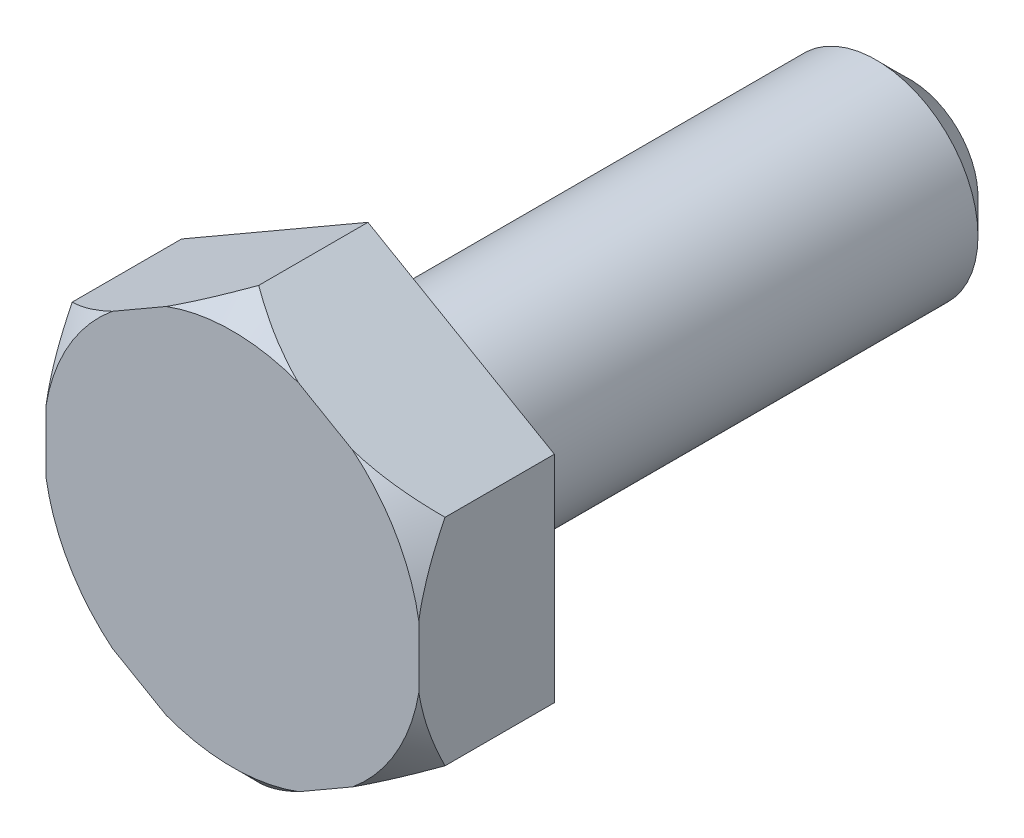
ISO-10303-21;
HEADER;
FILE_DESCRIPTION(('STEP AP214'),'2;1');
FILE_NAME('part.step','',(''),(''),'','','');
FILE_SCHEMA(('AUTOMOTIVE_DESIGN { 1 0 10303 214 1 1 1 1 }'));
ENDSEC;
DATA;
#1=APPLICATION_CONTEXT('core data for automotive mechanical design processes');
#2=APPLICATION_PROTOCOL_DEFINITION('international standard','automotive_design',2000,#1);
#3=PRODUCT_CONTEXT('',#1,'mechanical');
#4=PRODUCT('Part','Part','',(#3));
#5=PRODUCT_RELATED_PRODUCT_CATEGORY('part','',(#4));
#6=PRODUCT_DEFINITION_FORMATION('','',#4);
#7=PRODUCT_DEFINITION_CONTEXT('part definition',#1,'design');
#8=PRODUCT_DEFINITION('design','',#6,#7);
#9=PRODUCT_DEFINITION_SHAPE('','',#8);
#10=(LENGTH_UNIT() NAMED_UNIT(*) SI_UNIT(.MILLI.,.METRE.));
#11=(NAMED_UNIT(*) PLANE_ANGLE_UNIT() SI_UNIT($,.RADIAN.));
#12=(NAMED_UNIT(*) SI_UNIT($,.STERADIAN.) SOLID_ANGLE_UNIT());
#13=UNCERTAINTY_MEASURE_WITH_UNIT(LENGTH_MEASURE(1.E-05),#10,'distance_accuracy_value','');
#14=(GEOMETRIC_REPRESENTATION_CONTEXT(3) GLOBAL_UNCERTAINTY_ASSIGNED_CONTEXT((#13)) GLOBAL_UNIT_ASSIGNED_CONTEXT((#10,
#11,#12)) REPRESENTATION_CONTEXT('',''));
#15=CARTESIAN_POINT('',(0.,0.,0.));
#16=DIRECTION('',(0.,0.,1.));
#17=DIRECTION('',(1.,0.,0.));
#18=AXIS2_PLACEMENT_3D('',#15,#16,#17);
#19=CARTESIAN_POINT('',(2.75,1.58771324027147,2.));
#20=DIRECTION('',(-0.5,-0.866025403784439,0.));
#21=DIRECTION('',(0.866025403784439,-0.5,0.));
#22=AXIS2_PLACEMENT_3D('',#19,#20,#21);
#23=PLANE('',#22);
#24=CARTESIAN_POINT('',(4.66958955139388,0.479437696040624,0.093788957752243));
#25=CARTESIAN_POINT('',(4.60441484032006,0.517066333023451,0.154774737741755));
#26=CARTESIAN_POINT('',(4.53898089465047,0.554844639169929,0.215392406104886));
#27=CARTESIAN_POINT('',(4.40750606838666,0.630751665504996,0.335757370131462));
#28=CARTESIAN_POINT('',(4.34146513347783,0.668880417052145,0.395504586643845));
#29=CARTESIAN_POINT('',(4.1420076299657,0.78403726039676,0.573498791017025));
#30=CARTESIAN_POINT('',(4.00755920868051,0.861661092617886,0.690212913346168));
#31=CARTESIAN_POINT('',(3.73126732462415,1.02117828625273,0.921061723123524));
#32=CARTESIAN_POINT('',(3.58932217595587,1.10313035604653,1.03503637408588));
#33=CARTESIAN_POINT('',(3.3726061216146,1.22825142835817,1.19917277096917));
#34=CARTESIAN_POINT('',(3.29976455167439,1.27030652837135,1.25272706335612));
#35=CARTESIAN_POINT('',(3.15259148483079,1.35527693813097,1.357023187916));
#36=CARTESIAN_POINT('',(3.07826017850231,1.39819213784893,1.40776537674035));
#37=CARTESIAN_POINT('',(2.92603549038609,1.48607910251013,1.50696275400355));
#38=CARTESIAN_POINT('',(2.84809945877353,1.53107549134122,1.55533124355562));
#39=CARTESIAN_POINT('',(2.69017668777735,1.62225224568703,1.64745507024101));
#40=CARTESIAN_POINT('',(2.61018965810214,1.66843277880169,1.69120974982009));
#41=CARTESIAN_POINT('',(2.44842869871677,1.76182551224721,1.77266387572655));
#42=CARTESIAN_POINT('',(2.36666679801926,1.80903076762437,1.81039484404114));
#43=CARTESIAN_POINT('',(2.20089991474521,1.90473632230537,1.87863115630092));
#44=CARTESIAN_POINT('',(2.11689561718412,1.95323622611535,1.90913867940756));
#45=CARTESIAN_POINT('',(1.96344796652334,2.04182926853087,1.95624934937513));
#46=CARTESIAN_POINT('',(1.89436394685422,2.08171494588354,1.97440428968936));
#47=CARTESIAN_POINT('',(1.75514782791657,2.16209140962772,2.00423252626804));
#48=CARTESIAN_POINT('',(1.68501588246467,2.20258210721317,2.01590676436966));
#49=CARTESIAN_POINT('',(1.54425450935462,2.28385072386976,2.03217388051576));
#50=CARTESIAN_POINT('',(1.47362617375373,2.32462801244135,2.03677917847732));
#51=CARTESIAN_POINT('',(1.3322931707472,2.40622665977255,2.0386947686257));
#52=CARTESIAN_POINT('',(1.26158850253329,2.44704801899881,2.03600498279361));
#53=CARTESIAN_POINT('',(1.12085109137616,2.52830280121543,2.02349645099222));
#54=CARTESIAN_POINT('',(1.0508170596106,2.56873696830771,2.01369673011655));
#55=CARTESIAN_POINT('',(0.911678683235909,2.64906854736225,1.98749176240281));
#56=CARTESIAN_POINT('',(0.842574563268565,2.6889658296275,1.97108494805404));
#57=CARTESIAN_POINT('',(0.705423434323579,2.76815007084355,1.93234245836785));
#58=CARTESIAN_POINT('',(0.637380145036866,2.80743488222978,1.90998943632815));
#59=CARTESIAN_POINT('',(0.502722664151644,2.88517941506726,1.86020318748511));
#60=CARTESIAN_POINT('',(0.436108404884452,2.92363917558704,1.83277020182783));
#61=CARTESIAN_POINT('',(0.280797222208242,3.01330812871331,1.76306052867668));
#62=CARTESIAN_POINT('',(0.192709389397134,3.06416566269914,1.71898144548281));
#63=CARTESIAN_POINT('',(0.0190240142354092,3.16444296080306,1.62466513161923));
#64=CARTESIAN_POINT('',(-0.0665721787200468,3.2138619458475,1.57442463816634));
#65=CARTESIAN_POINT('',(-0.235694614989529,3.31150482995369,1.46906452792055));
#66=CARTESIAN_POINT('',(-0.319216183468037,3.3597260299979,1.41393498180409));
#67=CARTESIAN_POINT('',(-0.484296668894426,3.45503529269678,1.29994998261181));
#68=CARTESIAN_POINT('',(-0.5658559283834,3.50212355311764,1.24109518642519));
#69=CARTESIAN_POINT('',(-0.72768872041682,3.59555775916185,1.12016577951028));
#70=CARTESIAN_POINT('',(-0.807954624092135,3.64189930025554,1.05807761783114));
#71=CARTESIAN_POINT('',(-0.967073214839702,3.73376646145672,0.931526648468574));
#72=CARTESIAN_POINT('',(-1.04592578337278,3.77929201312558,0.867063642974939));
#73=CARTESIAN_POINT('',(-1.28052409052519,3.91473740891146,0.67097235512431));
#74=CARTESIAN_POINT('',(-1.4344906124915,4.0036300218149,0.536504118011291));
#75=CARTESIAN_POINT('',(-1.64275524246288,4.12387166199155,0.349080544323272));
#76=CARTESIAN_POINT('',(-1.69855409741102,4.15608714591634,0.298311225114301));
#77=CARTESIAN_POINT('',(-1.80949235141935,4.22013737673147,0.196378418456148));
#78=CARTESIAN_POINT('',(-1.86463354967088,4.25197316238543,0.145217542902118));
#79=CARTESIAN_POINT('',(-1.91958955139388,4.28370202477379,0.0937889577522435));
#80=B_SPLINE_CURVE_WITH_KNOTS('',3,(#24,#25,#26,#27,#28,#29,#30,#31,#32,#33,#34,#35,#36,#37,#38,
#39,#40,#41,#42,#43,#44,#45,#46,#47,#48,#49,#50,#51,#52,#53,#54,#55,#56,#57,#58,#59,#60,#61,#62,
#63,#64,#65,#66,#67,#68,#69,#70,#71,#72,#73,#74,#75,#76,#77,#78,#79),.UNSPECIFIED.,.F.,.F.,(4,2,
2,2,2,2,2,2,2,2,2,2,2,2,2,2,2,2,2,2,2,2,2,2,2,2,2,4),(0.,0.290595858345574,0.581217977981452,
1.16381598655404,1.76248956268558,2.06158497069685,2.36064235803204,2.66703976306786,
2.97348077661449,3.27826153997064,3.58295023989828,3.82815016223384,4.07331444045406,
4.31804747729323,4.56278313149482,4.80686631468259,5.0510074399324,5.29586875398521,
5.54071844744164,5.87300523717871,6.20546875586519,6.53862366394367,6.87171998818303,
7.20634671156636,7.54100137064173,8.20956289811674,8.45565152417676,8.70068842299397),.UNSPECIFIED.);
#81=CARTESIAN_POINT('',(2.75,1.58771324027147,1.6125));
#82=VERTEX_POINT('',#81);
#83=CARTESIAN_POINT('',(1.7718948798919,2.15242249466163,2.));
#84=VERTEX_POINT('',#83);
#85=EDGE_CURVE('E120',#82,#84,#80,.T.);
#86=ORIENTED_EDGE('',*,*,#85,.F.);
#87=DIRECTION('',(0.,0.,-1.));
#88=VECTOR('',#87,1.);
#89=CARTESIAN_POINT('',(2.75,1.58771324027147,2.));
#90=LINE('',#89,#88);
#91=CARTESIAN_POINT('',(2.75,1.58771324027147,0.));
#92=VERTEX_POINT('',#91);
#93=EDGE_CURVE('E131',#82,#92,#90,.T.);
#94=ORIENTED_EDGE('',*,*,#93,.T.);
#95=DIRECTION('',(-0.866025403784439,0.5,0.));
#96=VECTOR('',#95,1.);
#97=CARTESIAN_POINT('',(2.75,1.58771324027147,0.));
#98=LINE('',#97,#96);
#99=CARTESIAN_POINT('',(0.,3.17542648054294,0.));
#100=VERTEX_POINT('',#99);
#101=EDGE_CURVE('E210',#92,#100,#98,.T.);
#102=ORIENTED_EDGE('',*,*,#101,.T.);
#103=DIRECTION('',(0.,0.,-1.));
#104=VECTOR('',#103,1.);
#105=CARTESIAN_POINT('',(0.,3.17542648054294,2.));
#106=LINE('',#105,#104);
#107=CARTESIAN_POINT('',(0.,3.17542648054294,1.6125));
#108=VERTEX_POINT('',#107);
#109=EDGE_CURVE('E156',#108,#100,#106,.T.);
#110=ORIENTED_EDGE('',*,*,#109,.F.);
#111=CARTESIAN_POINT('',(0.978105120108094,2.61071722615278,2.));
#112=VERTEX_POINT('',#111);
#113=EDGE_CURVE('E137',#112,#108,#80,.T.);
#114=ORIENTED_EDGE('',*,*,#113,.F.);
#115=DIRECTION('',(-0.866025403784439,0.5,0.));
#116=VECTOR('',#115,1.);
#117=CARTESIAN_POINT('',(2.75,1.58771324027147,2.));
#118=LINE('',#117,#116);
#119=EDGE_CURVE('E135',#84,#112,#118,.T.);
#120=ORIENTED_EDGE('',*,*,#119,.F.);
#121=EDGE_LOOP('',(#86,#94,#102,#110,#114,#120));
#122=FACE_BOUND('',#121,.T.);
#123=ADVANCED_FACE('F29',(#122),#23,.F.);
#124=CARTESIAN_POINT('',(0.,3.17542648054294,2.));
#125=DIRECTION('',(0.5,-0.866025403784439,0.));
#126=DIRECTION('',(0.866025403784439,0.5,0.));
#127=AXIS2_PLACEMENT_3D('',#124,#125,#126);
#128=PLANE('',#127);
#129=CARTESIAN_POINT('',(1.91958955139388,4.28370202477379,0.0937889577522418));
#130=CARTESIAN_POINT('',(1.85441484032006,4.24607338779096,0.154774737741754));
#131=CARTESIAN_POINT('',(1.78898089465047,4.20829508164449,0.215392406104885));
#132=CARTESIAN_POINT('',(1.65750606838666,4.13238805530942,0.335757370131461));
#133=CARTESIAN_POINT('',(1.59146513347783,4.09425930376227,0.395504586643845));
#134=CARTESIAN_POINT('',(1.3920076299657,3.97910246041765,0.573498791017025));
#135=CARTESIAN_POINT('',(1.25755920868051,3.90147862819653,0.690212913346168));
#136=CARTESIAN_POINT('',(0.981267324624152,3.74196143456168,0.921061723123524));
#137=CARTESIAN_POINT('',(0.839322175955873,3.66000936476789,1.03503637408588));
#138=CARTESIAN_POINT('',(0.622606121614599,3.53488829245624,1.19917277096917));
#139=CARTESIAN_POINT('',(0.549764551674393,3.49283319244307,1.25272706335612));
#140=CARTESIAN_POINT('',(0.402591484830788,3.40786278268345,1.357023187916));
#141=CARTESIAN_POINT('',(0.328260178502314,3.36494758296549,1.40776537674035));
#142=CARTESIAN_POINT('',(0.176035490386096,3.27706061830428,1.50696275400355));
#143=CARTESIAN_POINT('',(0.0980994587735362,3.2320642294732,1.55533124355562));
#144=CARTESIAN_POINT('',(-0.059823312222643,3.14088747512738,1.64745507024101));
#145=CARTESIAN_POINT('',(-0.139810341897853,3.09470694201272,1.69120974982009));
#146=CARTESIAN_POINT('',(-0.301571301283232,3.0013142085672,1.77266387572655));
#147=CARTESIAN_POINT('',(-0.383333201980741,2.95410895319004,1.81039484404114));
#148=CARTESIAN_POINT('',(-0.549100085254788,2.85840339850904,1.87863115630092));
#149=CARTESIAN_POINT('',(-0.633104382815874,2.80990349469906,1.90913867940756));
#150=CARTESIAN_POINT('',(-0.786552033476664,2.72131045228354,1.95624934937513));
#151=CARTESIAN_POINT('',(-0.855636053145779,2.68142477493088,1.97440428968936));
#152=CARTESIAN_POINT('',(-0.994852172083431,2.60104831118669,2.00423252626804));
#153=CARTESIAN_POINT('',(-1.06498411753532,2.56055761360125,2.01590676436966));
#154=CARTESIAN_POINT('',(-1.20574549064538,2.47928899694465,2.03217388051576));
#155=CARTESIAN_POINT('',(-1.27637382624627,2.43851170837306,2.03677917847732));
#156=CARTESIAN_POINT('',(-1.4177068292528,2.35691306104187,2.0386947686257));
#157=CARTESIAN_POINT('',(-1.48841149746671,2.3160917018156,2.03600498279361));
#158=CARTESIAN_POINT('',(-1.62914890862384,2.23483691959898,2.02349645099222));
#159=CARTESIAN_POINT('',(-1.69918294038939,2.1944027525067,2.01369673011655));
#160=CARTESIAN_POINT('',(-1.83832131676409,2.11407117345217,1.98749176240281));
#161=CARTESIAN_POINT('',(-1.90742543673143,2.07417389118691,1.97108494805404));
#162=CARTESIAN_POINT('',(-2.04457656567642,1.99498964997086,1.93234245836785));
#163=CARTESIAN_POINT('',(-2.11261985496313,1.95570483858463,1.90998943632815));
#164=CARTESIAN_POINT('',(-2.24727733584835,1.87796030574715,1.86020318748511));
#165=CARTESIAN_POINT('',(-2.31389159511555,1.83950054522737,1.83277020182782));
#166=CARTESIAN_POINT('',(-2.46920277779176,1.7498315921011,1.76306052867668));
#167=CARTESIAN_POINT('',(-2.55729061060286,1.69897405811527,1.71898144548281));
#168=CARTESIAN_POINT('',(-2.73097598576459,1.59869676001135,1.62466513161923));
#169=CARTESIAN_POINT('',(-2.81657217872005,1.54927777496691,1.57442463816634));
#170=CARTESIAN_POINT('',(-2.98569461498953,1.45163489086072,1.46906452792055));
#171=CARTESIAN_POINT('',(-3.06921618346804,1.40341369081652,1.41393498180409));
#172=CARTESIAN_POINT('',(-3.23429666889443,1.30810442811764,1.29994998261181));
#173=CARTESIAN_POINT('',(-3.3158559283834,1.26101616769677,1.24109518642519));
#174=CARTESIAN_POINT('',(-3.47768872041682,1.16758196165257,1.12016577951028));
#175=CARTESIAN_POINT('',(-3.55795462409213,1.12124042055887,1.05807761783114));
#176=CARTESIAN_POINT('',(-3.7170732148397,1.02937325935769,0.931526648468572));
#177=CARTESIAN_POINT('',(-3.79592578337278,0.983847707688829,0.867063642974937));
#178=CARTESIAN_POINT('',(-4.03052409052519,0.848402311902952,0.670972355124308));
#179=CARTESIAN_POINT('',(-4.1844906124915,0.759509698999514,0.536504118011289));
#180=CARTESIAN_POINT('',(-4.39275524246288,0.639268058822856,0.34908054432327));
#181=CARTESIAN_POINT('',(-4.44855409741102,0.607052574898074,0.298311225114299));
#182=CARTESIAN_POINT('',(-4.55949235141935,0.543002344082941,0.196378418456146));
#183=CARTESIAN_POINT('',(-4.61463354967088,0.51116655842898,0.145217542902116));
#184=CARTESIAN_POINT('',(-4.66958955139388,0.479437696040621,0.0937889577522409));
#185=B_SPLINE_CURVE_WITH_KNOTS('',3,(#129,#130,#131,#132,#133,#134,#135,#136,#137,#138,#139,
#140,#141,#142,#143,#144,#145,#146,#147,#148,#149,#150,#151,#152,#153,#154,#155,#156,#157,#158,
#159,#160,#161,#162,#163,#164,#165,#166,#167,#168,#169,#170,#171,#172,#173,#174,#175,#176,#177,
#178,#179,#180,#181,#182,#183,#184),.UNSPECIFIED.,.F.,.F.,(4,2,2,2,2,2,2,2,2,2,2,2,2,2,2,2,2,2,
2,2,2,2,2,2,2,2,2,4),(0.,0.290595858345574,0.581217977981453,1.16381598655404,1.76248956268558,
2.06158497069685,2.36064235803204,2.66703976306787,2.97348077661449,3.27826153997064,
3.58295023989828,3.82815016223384,4.07331444045406,4.31804747729324,4.56278313149482,
4.8068663146826,5.0510074399324,5.29586875398522,5.54071844744165,5.87300523717871,
6.2054687558652,6.53862366394368,6.87171998818303,7.20634671156637,7.54100137064173,
8.20956289811675,8.45565152417677,8.70068842299398),.UNSPECIFIED.);
#186=CARTESIAN_POINT('',(-0.978105120108092,2.61071722615278,2.));
#187=VERTEX_POINT('',#186);
#188=EDGE_CURVE('E218',#108,#187,#185,.T.);
#189=ORIENTED_EDGE('',*,*,#188,.F.);
#190=ORIENTED_EDGE('',*,*,#109,.T.);
#191=DIRECTION('',(-0.866025403784439,-0.5,0.));
#192=VECTOR('',#191,1.);
#193=CARTESIAN_POINT('',(0.,3.17542648054294,0.));
#194=LINE('',#193,#192);
#195=CARTESIAN_POINT('',(-2.75,1.58771324027147,0.));
#196=VERTEX_POINT('',#195);
#197=EDGE_CURVE('E207',#100,#196,#194,.T.);
#198=ORIENTED_EDGE('',*,*,#197,.T.);
#199=DIRECTION('',(0.,0.,-1.));
#200=VECTOR('',#199,1.);
#201=CARTESIAN_POINT('',(-2.75,1.58771324027147,2.));
#202=LINE('',#201,#200);
#203=CARTESIAN_POINT('',(-2.75,1.58771324027147,1.6125));
#204=VERTEX_POINT('',#203);
#205=EDGE_CURVE('E154',#204,#196,#202,.T.);
#206=ORIENTED_EDGE('',*,*,#205,.F.);
#207=CARTESIAN_POINT('',(-1.77189487989191,2.15242249466163,2.));
#208=VERTEX_POINT('',#207);
#209=EDGE_CURVE('E212',#208,#204,#185,.T.);
#210=ORIENTED_EDGE('',*,*,#209,.F.);
#211=DIRECTION('',(-0.866025403784439,-0.5,0.));
#212=VECTOR('',#211,1.);
#213=CARTESIAN_POINT('',(0.,3.17542648054294,2.));
#214=LINE('',#213,#212);
#215=EDGE_CURVE('E194',#187,#208,#214,.T.);
#216=ORIENTED_EDGE('',*,*,#215,.F.);
#217=EDGE_LOOP('',(#189,#190,#198,#206,#210,#216));
#218=FACE_BOUND('',#217,.T.);
#219=ADVANCED_FACE('F226',(#218),#128,.F.);
#220=CARTESIAN_POINT('',(-2.75,1.58771324027147,2.));
#221=DIRECTION('',(1.,0.,0.));
#222=DIRECTION('',(0.,1.,0.));
#223=AXIS2_PLACEMENT_3D('',#220,#221,#222);
#224=PLANE('',#223);
#225=CARTESIAN_POINT('',(-2.75,3.50730279166535,0.33105842411323));
#226=CARTESIAN_POINT('',(-2.75,3.42870317339037,0.392900907457568));
#227=CARTESIAN_POINT('',(-2.75,3.34972620804174,0.454269938288023));
#228=CARTESIAN_POINT('',(-2.75,3.19087184058861,0.575857610553295));
#229=CARTESIAN_POINT('',(-2.75,3.11099429268869,0.636076061341786));
#230=CARTESIAN_POINT('',(-2.75,2.94981264678402,0.755439373877893));
#231=CARTESIAN_POINT('',(-2.75,2.86850338061817,0.814577275130536));
#232=CARTESIAN_POINT('',(-2.75,2.70469217770677,0.931172957965213));
#233=CARTESIAN_POINT('',(-2.75,2.62219029821338,0.988630819800968));
#234=CARTESIAN_POINT('',(-2.75,2.45167557605139,1.10430121860068));
#235=CARTESIAN_POINT('',(-2.75,2.3635921845117,1.1624101522015));
#236=CARTESIAN_POINT('',(-2.75,2.1856429567431,1.27582833555173));
#237=CARTESIAN_POINT('',(-2.75,2.09577726966914,1.33113781821423));
#238=CARTESIAN_POINT('',(-2.75,1.91413710110035,1.43814381459371));
#239=CARTESIAN_POINT('',(-2.75,1.82236655274616,1.48984696607768));
#240=CARTESIAN_POINT('',(-2.75,1.63647065339914,1.58881007541239));
#241=CARTESIAN_POINT('',(-2.75,1.54234594985981,1.636071238276));
#242=CARTESIAN_POINT('',(-2.75,1.36133539185947,1.72035346198254));
#243=CARTESIAN_POINT('',(-2.75,1.27470921837869,1.75792812280123));
#244=CARTESIAN_POINT('',(-2.75,1.0992019377873,1.82747792905203));
#245=CARTESIAN_POINT('',(-2.75,1.01032061534219,1.85945253743801));
#246=CARTESIAN_POINT('',(-2.75,0.831381050044099,1.91623974261218));
#247=CARTESIAN_POINT('',(-2.75,0.741347669718496,1.94112961905982));
#248=CARTESIAN_POINT('',(-2.75,0.559465612563583,1.98298775140265));
#249=CARTESIAN_POINT('',(-2.75,0.467617678856776,1.9999591828424));
#250=CARTESIAN_POINT('',(-2.75,0.280953870509931,2.02518600120318));
#251=CARTESIAN_POINT('',(-2.75,0.186114626174255,2.03327221452758));
#252=CARTESIAN_POINT('',(-2.75,-0.00388901596431982,2.03956283159107));
#253=CARTESIAN_POINT('',(-2.75,-0.099053384321794,2.03776810768418));
#254=CARTESIAN_POINT('',(-2.75,-0.288970809940164,2.02441432795312));
#255=CARTESIAN_POINT('',(-2.75,-0.383721748799293,2.01282571813624));
#256=CARTESIAN_POINT('',(-2.75,-0.57167700101973,1.98066333836803));
#257=CARTESIAN_POINT('',(-2.75,-0.664880892688038,1.9600871590229));
#258=CARTESIAN_POINT('',(-2.75,-0.877674423285607,1.90361026147312));
#259=CARTESIAN_POINT('',(-2.75,-0.99652279367134,1.86493929139243));
#260=CARTESIAN_POINT('',(-2.75,-1.23030197652999,1.77721764467337));
#261=CARTESIAN_POINT('',(-2.75,-1.34523039248928,1.72816074600533));
#262=CARTESIAN_POINT('',(-2.75,-1.57219287338806,1.62183018798945));
#263=CARTESIAN_POINT('',(-2.75,-1.68419972941579,1.5644992333651));
#264=CARTESIAN_POINT('',(-2.75,-1.90489189219909,1.44389008758862));
#265=CARTESIAN_POINT('',(-2.75,-2.01357796583799,1.38061328350656));
#266=CARTESIAN_POINT('',(-2.75,-2.2432275942124,1.24036730245766));
#267=CARTESIAN_POINT('',(-2.75,-2.36377566899355,1.16272232527227));
#268=CARTESIAN_POINT('',(-2.75,-2.60197692227295,1.0030902321217));
#269=CARTESIAN_POINT('',(-2.75,-2.71962945743761,0.921102163735237));
#270=CARTESIAN_POINT('',(-2.75,-2.94999461698297,0.755723337117312));
#271=CARTESIAN_POINT('',(-2.75,-3.06275892151427,0.672404160914846));
#272=CARTESIAN_POINT('',(-2.75,-3.28635719844813,0.503372886933204));
#273=CARTESIAN_POINT('',(-2.75,-3.39719248565548,0.41766253170921));
#274=CARTESIAN_POINT('',(-2.75,-3.50730279166535,0.331058424113229));
#275=B_SPLINE_CURVE_WITH_KNOTS('',3,(#225,#226,#227,#228,#229,#230,#231,#232,#233,#234,#235,
#236,#237,#238,#239,#240,#241,#242,#243,#244,#245,#246,#247,#248,#249,#250,#251,#252,#253,#254,
#255,#256,#257,#258,#259,#260,#261,#262,#263,#264,#265,#266,#267,#268,#269,#270,#271,#272,#273,
#274),.UNSPECIFIED.,.F.,.F.,(4,2,2,2,2,2,2,2,2,2,2,2,2,2,2,2,2,2,2,2,2,2,2,2,4),(0.,
0.300039705456414,0.600128702494929,0.901733710867804,1.20332428826999,1.51985421037003,
1.83635775388291,2.1522624709151,2.46808124115691,2.75119692565999,3.0343397461648,
3.31426406151264,3.59407602174572,3.87912791107544,4.16415463455598,4.45004453734126,
4.7360111287714,5.11029798578883,5.48480970930319,5.86205173191312,6.23920596754517,
6.66924644811957,7.09938162831765,7.51996479571003,7.94024908449555),.UNSPECIFIED.);
#276=CARTESIAN_POINT('',(-2.75,0.45829473149115,2.));
#277=VERTEX_POINT('',#276);
#278=EDGE_CURVE('E219',#204,#277,#275,.T.);
#279=ORIENTED_EDGE('',*,*,#278,.F.);
#280=ORIENTED_EDGE('',*,*,#205,.T.);
#281=DIRECTION('',(0.,-1.,0.));
#282=VECTOR('',#281,1.);
#283=CARTESIAN_POINT('',(-2.75,1.58771324027147,0.));
#284=LINE('',#283,#282);
#285=CARTESIAN_POINT('',(-2.75,-1.58771324027147,0.));
#286=VERTEX_POINT('',#285);
#287=EDGE_CURVE('E204',#196,#286,#284,.T.);
#288=ORIENTED_EDGE('',*,*,#287,.T.);
#289=DIRECTION('',(0.,0.,-1.));
#290=VECTOR('',#289,1.);
#291=CARTESIAN_POINT('',(-2.75,-1.58771324027147,2.));
#292=LINE('',#291,#290);
#293=CARTESIAN_POINT('',(-2.75,-1.58771324027147,1.6125));
#294=VERTEX_POINT('',#293);
#295=EDGE_CURVE('E152',#294,#286,#292,.T.);
#296=ORIENTED_EDGE('',*,*,#295,.F.);
#297=CARTESIAN_POINT('',(-2.75,-0.458294731491151,2.));
#298=VERTEX_POINT('',#297);
#299=EDGE_CURVE('E220',#298,#294,#275,.T.);
#300=ORIENTED_EDGE('',*,*,#299,.F.);
#301=DIRECTION('',(0.,-1.,0.));
#302=VECTOR('',#301,1.);
#303=CARTESIAN_POINT('',(-2.75,1.58771324027147,2.));
#304=LINE('',#303,#302);
#305=EDGE_CURVE('E190',#277,#298,#304,.T.);
#306=ORIENTED_EDGE('',*,*,#305,.F.);
#307=EDGE_LOOP('',(#279,#280,#288,#296,#300,#306));
#308=FACE_BOUND('',#307,.T.);
#309=ADVANCED_FACE('F265',(#308),#224,.F.);
#310=CARTESIAN_POINT('',(-2.75,-1.58771324027147,2.));
#311=DIRECTION('',(0.5,0.866025403784439,0.));
#312=DIRECTION('',(-0.866025403784439,0.5,0.));
#313=AXIS2_PLACEMENT_3D('',#310,#311,#312);
#314=PLANE('',#313);
#315=CARTESIAN_POINT('',(-4.66958955139388,-0.479437696040623,0.093788957752241));
#316=CARTESIAN_POINT('',(-4.60441484032006,-0.517066333023449,0.154774737741753));
#317=CARTESIAN_POINT('',(-4.53898089465047,-0.554844639169927,0.215392406104883));
#318=CARTESIAN_POINT('',(-4.40750606838666,-0.630751665504994,0.33575737013146));
#319=CARTESIAN_POINT('',(-4.34146513347783,-0.668880417052144,0.395504586643843));
#320=CARTESIAN_POINT('',(-4.1420076299657,-0.784037260396759,0.573498791017024));
#321=CARTESIAN_POINT('',(-4.00755920868051,-0.861661092617885,0.690212913346166));
#322=CARTESIAN_POINT('',(-3.73126732462415,-1.02117828625273,0.921061723123523));
#323=CARTESIAN_POINT('',(-3.58932217595587,-1.10313035604653,1.03503637408588));
#324=CARTESIAN_POINT('',(-3.3726061216146,-1.22825142835817,1.19917277096917));
#325=CARTESIAN_POINT('',(-3.29976455167439,-1.27030652837135,1.25272706335612));
#326=CARTESIAN_POINT('',(-3.15259148483079,-1.35527693813097,1.357023187916));
#327=CARTESIAN_POINT('',(-3.07826017850231,-1.39819213784893,1.40776537674035));
#328=CARTESIAN_POINT('',(-2.9260354903861,-1.48607910251013,1.50696275400355));
#329=CARTESIAN_POINT('',(-2.84809945877353,-1.53107549134121,1.55533124355562));
#330=CARTESIAN_POINT('',(-2.69017668777736,-1.62225224568703,1.64745507024101));
#331=CARTESIAN_POINT('',(-2.61018965810215,-1.66843277880169,1.69120974982009));
#332=CARTESIAN_POINT('',(-2.44842869871677,-1.76182551224721,1.77266387572655));
#333=CARTESIAN_POINT('',(-2.36666679801926,-1.80903076762437,1.81039484404114));
#334=CARTESIAN_POINT('',(-2.20089991474521,-1.90473632230537,1.87863115630092));
#335=CARTESIAN_POINT('',(-2.11689561718412,-1.95323622611535,1.90913867940756));
#336=CARTESIAN_POINT('',(-1.96344796652334,-2.04182926853087,1.95624934937513));
#337=CARTESIAN_POINT('',(-1.89436394685422,-2.08171494588354,1.97440428968936));
#338=CARTESIAN_POINT('',(-1.75514782791657,-2.16209140962772,2.00423252626804));
#339=CARTESIAN_POINT('',(-1.68501588246468,-2.20258210721317,2.01590676436966));
#340=CARTESIAN_POINT('',(-1.54425450935462,-2.28385072386976,2.03217388051576));
#341=CARTESIAN_POINT('',(-1.47362617375373,-2.32462801244135,2.03677917847732));
#342=CARTESIAN_POINT('',(-1.3322931707472,-2.40622665977255,2.0386947686257));
#343=CARTESIAN_POINT('',(-1.26158850253329,-2.44704801899881,2.03600498279361));
#344=CARTESIAN_POINT('',(-1.12085109137616,-2.52830280121543,2.02349645099221));
#345=CARTESIAN_POINT('',(-1.05081705961061,-2.56873696830771,2.01369673011655));
#346=CARTESIAN_POINT('',(-0.911678683235909,-2.64906854736225,1.98749176240281));
#347=CARTESIAN_POINT('',(-0.842574563268565,-2.6889658296275,1.97108494805403));
#348=CARTESIAN_POINT('',(-0.70542343432358,-2.76815007084355,1.93234245836785));
#349=CARTESIAN_POINT('',(-0.637380145036867,-2.80743488222978,1.90998943632815));
#350=CARTESIAN_POINT('',(-0.502722664151644,-2.88517941506726,1.86020318748511));
#351=CARTESIAN_POINT('',(-0.436108404884453,-2.92363917558705,1.83277020182782));
#352=CARTESIAN_POINT('',(-0.280797222208242,-3.01330812871331,1.76306052867668));
#353=CARTESIAN_POINT('',(-0.192709389397134,-3.06416566269914,1.71898144548281));
#354=CARTESIAN_POINT('',(-0.0190240142354091,-3.16444296080306,1.62466513161923));
#355=CARTESIAN_POINT('',(0.0665721787200471,-3.2138619458475,1.57442463816634));
#356=CARTESIAN_POINT('',(0.235694614989529,-3.31150482995369,1.46906452792055));
#357=CARTESIAN_POINT('',(0.319216183468037,-3.3597260299979,1.41393498180409));
#358=CARTESIAN_POINT('',(0.484296668894426,-3.45503529269678,1.29994998261181));
#359=CARTESIAN_POINT('',(0.565855928383401,-3.50212355311764,1.24109518642519));
#360=CARTESIAN_POINT('',(0.727688720416821,-3.59555775916185,1.12016577951028));
#361=CARTESIAN_POINT('',(0.807954624092136,-3.64189930025554,1.05807761783114));
#362=CARTESIAN_POINT('',(0.967073214839703,-3.73376646145672,0.931526648468571));
#363=CARTESIAN_POINT('',(1.04592578337278,-3.77929201312558,0.867063642974936));
#364=CARTESIAN_POINT('',(1.28052409052519,-3.91473740891146,0.670972355124307));
#365=CARTESIAN_POINT('',(1.4344906124915,-4.0036300218149,0.536504118011288));
#366=CARTESIAN_POINT('',(1.64275524246288,-4.12387166199156,0.349080544323269));
#367=CARTESIAN_POINT('',(1.69855409741103,-4.15608714591634,0.298311225114298));
#368=CARTESIAN_POINT('',(1.80949235141935,-4.22013737673147,0.196378418456146));
#369=CARTESIAN_POINT('',(1.86463354967088,-4.25197316238543,0.145217542902116));
#370=CARTESIAN_POINT('',(1.91958955139388,-4.28370202477379,0.0937889577522414));
#371=B_SPLINE_CURVE_WITH_KNOTS('',3,(#315,#316,#317,#318,#319,#320,#321,#322,#323,#324,#325,
#326,#327,#328,#329,#330,#331,#332,#333,#334,#335,#336,#337,#338,#339,#340,#341,#342,#343,#344,
#345,#346,#347,#348,#349,#350,#351,#352,#353,#354,#355,#356,#357,#358,#359,#360,#361,#362,#363,
#364,#365,#366,#367,#368,#369,#370),.UNSPECIFIED.,.F.,.F.,(4,2,2,2,2,2,2,2,2,2,2,2,2,2,2,2,2,2,
2,2,2,2,2,2,2,2,2,4),(0.,0.290595858345573,0.581217977981452,1.16381598655404,1.76248956268558,
2.06158497069686,2.36064235803204,2.66703976306787,2.97348077661449,3.27826153997064,
3.58295023989829,3.82815016223384,4.07331444045406,4.31804747729324,4.56278313149482,
4.8068663146826,5.0510074399324,5.29586875398522,5.54071844744165,5.87300523717871,
6.2054687558652,6.53862366394368,6.87171998818304,7.20634671156637,7.54100137064174,
8.20956289811675,8.45565152417677,8.70068842299397),.UNSPECIFIED.);
#372=CARTESIAN_POINT('',(-1.7718948798919,-2.15242249466163,2.));
#373=VERTEX_POINT('',#372);
#374=EDGE_CURVE('E261',#294,#373,#371,.T.);
#375=ORIENTED_EDGE('',*,*,#374,.F.);
#376=ORIENTED_EDGE('',*,*,#295,.T.);
#377=DIRECTION('',(0.866025403784439,-0.5,0.));
#378=VECTOR('',#377,1.);
#379=CARTESIAN_POINT('',(-2.75,-1.58771324027147,0.));
#380=LINE('',#379,#378);
#381=CARTESIAN_POINT('',(0.,-3.17542648054294,0.));
#382=VERTEX_POINT('',#381);
#383=EDGE_CURVE('E201',#286,#382,#380,.T.);
#384=ORIENTED_EDGE('',*,*,#383,.T.);
#385=DIRECTION('',(0.,0.,-1.));
#386=VECTOR('',#385,1.);
#387=CARTESIAN_POINT('',(0.,-3.17542648054294,2.));
#388=LINE('',#387,#386);
#389=CARTESIAN_POINT('',(0.,-3.17542648054294,1.6125));
#390=VERTEX_POINT('',#389);
#391=EDGE_CURVE('E145',#390,#382,#388,.T.);
#392=ORIENTED_EDGE('',*,*,#391,.F.);
#393=CARTESIAN_POINT('',(-0.978105120108098,-2.61071722615278,2.));
#394=VERTEX_POINT('',#393);
#395=EDGE_CURVE('E256',#394,#390,#371,.T.);
#396=ORIENTED_EDGE('',*,*,#395,.F.);
#397=DIRECTION('',(0.866025403784439,-0.5,0.));
#398=VECTOR('',#397,1.);
#399=CARTESIAN_POINT('',(-2.75,-1.58771324027147,2.));
#400=LINE('',#399,#398);
#401=EDGE_CURVE('E182',#373,#394,#400,.T.);
#402=ORIENTED_EDGE('',*,*,#401,.F.);
#403=EDGE_LOOP('',(#375,#376,#384,#392,#396,#402));
#404=FACE_BOUND('',#403,.T.);
#405=ADVANCED_FACE('F262',(#404),#314,.F.);
#406=CARTESIAN_POINT('',(0.,-3.17542648054294,2.));
#407=DIRECTION('',(-0.5,0.866025403784439,0.));
#408=DIRECTION('',(-0.866025403784439,-0.5,0.));
#409=AXIS2_PLACEMENT_3D('',#406,#407,#408);
#410=PLANE('',#409);
#411=CARTESIAN_POINT('',(-1.91958955139388,-4.28370202477379,0.0937889577522404));
#412=CARTESIAN_POINT('',(-1.85441484032006,-4.24607338779096,0.154774737741752));
#413=CARTESIAN_POINT('',(-1.78898089465047,-4.20829508164449,0.215392406104883));
#414=CARTESIAN_POINT('',(-1.65750606838666,-4.13238805530942,0.335757370131459));
#415=CARTESIAN_POINT('',(-1.59146513347783,-4.09425930376227,0.395504586643843));
#416=CARTESIAN_POINT('',(-1.39200762996571,-3.97910246041766,0.573498791017023));
#417=CARTESIAN_POINT('',(-1.25755920868051,-3.90147862819653,0.690212913346166));
#418=CARTESIAN_POINT('',(-0.981267324624153,-3.74196143456168,0.921061723123522));
#419=CARTESIAN_POINT('',(-0.839322175955874,-3.66000936476789,1.03503637408588));
#420=CARTESIAN_POINT('',(-0.622606121614601,-3.53488829245624,1.19917277096916));
#421=CARTESIAN_POINT('',(-0.549764551674394,-3.49283319244307,1.25272706335612));
#422=CARTESIAN_POINT('',(-0.40259148483079,-3.40786278268345,1.357023187916));
#423=CARTESIAN_POINT('',(-0.328260178502315,-3.36494758296549,1.40776537674034));
#424=CARTESIAN_POINT('',(-0.176035490386098,-3.27706061830428,1.50696275400355));
#425=CARTESIAN_POINT('',(-0.0980994587735374,-3.2320642294732,1.55533124355562));
#426=CARTESIAN_POINT('',(0.059823312222642,-3.14088747512738,1.64745507024101));
#427=CARTESIAN_POINT('',(0.139810341897852,-3.09470694201272,1.69120974982008));
#428=CARTESIAN_POINT('',(0.301571301283231,-3.0013142085672,1.77266387572655));
#429=CARTESIAN_POINT('',(0.38333320198074,-2.95410895319004,1.81039484404114));
#430=CARTESIAN_POINT('',(0.549100085254787,-2.85840339850904,1.87863115630092));
#431=CARTESIAN_POINT('',(0.633104382815873,-2.80990349469907,1.90913867940756));
#432=CARTESIAN_POINT('',(0.786552033476663,-2.72131045228354,1.95624934937513));
#433=CARTESIAN_POINT('',(0.855636053145779,-2.68142477493088,1.97440428968935));
#434=CARTESIAN_POINT('',(0.99485217208343,-2.60104831118669,2.00423252626804));
#435=CARTESIAN_POINT('',(1.06498411753532,-2.56055761360125,2.01590676436966));
#436=CARTESIAN_POINT('',(1.20574549064538,-2.47928899694465,2.03217388051576));
#437=CARTESIAN_POINT('',(1.27637382624627,-2.43851170837306,2.03677917847732));
#438=CARTESIAN_POINT('',(1.4177068292528,-2.35691306104187,2.0386947686257));
#439=CARTESIAN_POINT('',(1.48841149746671,-2.31609170181561,2.03600498279361));
#440=CARTESIAN_POINT('',(1.62914890862384,-2.23483691959898,2.02349645099221));
#441=CARTESIAN_POINT('',(1.69918294038939,-2.19440275250671,2.01369673011655));
#442=CARTESIAN_POINT('',(1.83832131676409,-2.11407117345217,1.98749176240281));
#443=CARTESIAN_POINT('',(1.90742543673143,-2.07417389118691,1.97108494805403));
#444=CARTESIAN_POINT('',(2.04457656567642,-1.99498964997086,1.93234245836785));
#445=CARTESIAN_POINT('',(2.11261985496313,-1.95570483858463,1.90998943632815));
#446=CARTESIAN_POINT('',(2.24727733584835,-1.87796030574715,1.86020318748511));
#447=CARTESIAN_POINT('',(2.31389159511555,-1.83950054522737,1.83277020182782));
#448=CARTESIAN_POINT('',(2.46920277779176,-1.7498315921011,1.76306052867668));
#449=CARTESIAN_POINT('',(2.55729061060287,-1.69897405811528,1.71898144548281));
#450=CARTESIAN_POINT('',(2.73097598576459,-1.59869676001135,1.62466513161923));
#451=CARTESIAN_POINT('',(2.81657217872005,-1.54927777496691,1.57442463816634));
#452=CARTESIAN_POINT('',(2.98569461498953,-1.45163489086072,1.46906452792055));
#453=CARTESIAN_POINT('',(3.06921618346804,-1.40341369081651,1.41393498180409));
#454=CARTESIAN_POINT('',(3.23429666889443,-1.30810442811763,1.29994998261181));
#455=CARTESIAN_POINT('',(3.3158559283834,-1.26101616769677,1.24109518642519));
#456=CARTESIAN_POINT('',(3.47768872041682,-1.16758196165257,1.12016577951028));
#457=CARTESIAN_POINT('',(3.55795462409213,-1.12124042055887,1.05807761783114));
#458=CARTESIAN_POINT('',(3.7170732148397,-1.02937325935769,0.931526648468572));
#459=CARTESIAN_POINT('',(3.79592578337278,-0.983847707688829,0.867063642974936));
#460=CARTESIAN_POINT('',(4.03052409052519,-0.848402311902952,0.670972355124308));
#461=CARTESIAN_POINT('',(4.1844906124915,-0.759509698999514,0.536504118011289));
#462=CARTESIAN_POINT('',(4.39275524246288,-0.639268058822856,0.349080544323269));
#463=CARTESIAN_POINT('',(4.44855409741103,-0.607052574898074,0.298311225114298));
#464=CARTESIAN_POINT('',(4.55949235141935,-0.543002344082941,0.196378418456145));
#465=CARTESIAN_POINT('',(4.61463354967088,-0.51116655842898,0.145217542902115));
#466=CARTESIAN_POINT('',(4.66958955139388,-0.479437696040622,0.0937889577522408));
#467=B_SPLINE_CURVE_WITH_KNOTS('',3,(#411,#412,#413,#414,#415,#416,#417,#418,#419,#420,#421,
#422,#423,#424,#425,#426,#427,#428,#429,#430,#431,#432,#433,#434,#435,#436,#437,#438,#439,#440,
#441,#442,#443,#444,#445,#446,#447,#448,#449,#450,#451,#452,#453,#454,#455,#456,#457,#458,#459,
#460,#461,#462,#463,#464,#465,#466),.UNSPECIFIED.,.F.,.F.,(4,2,2,2,2,2,2,2,2,2,2,2,2,2,2,2,2,2,
2,2,2,2,2,2,2,2,2,4),(0.,0.290595858345574,0.581217977981452,1.16381598655404,1.76248956268558,
2.06158497069685,2.36064235803204,2.66703976306786,2.97348077661449,3.27826153997064,
3.58295023989828,3.82815016223384,4.07331444045406,4.31804747729324,4.56278313149482,
4.8068663146826,5.0510074399324,5.29586875398522,5.54071844744165,5.87300523717871,
6.2054687558652,6.53862366394368,6.87171998818304,7.20634671156637,7.54100137064173,
8.20956289811675,8.45565152417677,8.70068842299397),.UNSPECIFIED.);
#468=CARTESIAN_POINT('',(0.978105120108093,-2.61071722615278,2.));
#469=VERTEX_POINT('',#468);
#470=EDGE_CURVE('E52',#390,#469,#467,.T.);
#471=ORIENTED_EDGE('',*,*,#470,.F.);
#472=ORIENTED_EDGE('',*,*,#391,.T.);
#473=DIRECTION('',(0.866025403784438,0.5,0.));
#474=VECTOR('',#473,1.);
#475=CARTESIAN_POINT('',(0.,-3.17542648054294,0.));
#476=LINE('',#475,#474);
#477=CARTESIAN_POINT('',(2.75,-1.58771324027147,0.));
#478=VERTEX_POINT('',#477);
#479=EDGE_CURVE('E198',#382,#478,#476,.T.);
#480=ORIENTED_EDGE('',*,*,#479,.T.);
#481=DIRECTION('',(0.,0.,-1.));
#482=VECTOR('',#481,1.);
#483=CARTESIAN_POINT('',(2.75,-1.58771324027147,2.));
#484=LINE('',#483,#482);
#485=CARTESIAN_POINT('',(2.75,-1.58771324027147,1.6125));
#486=VERTEX_POINT('',#485);
#487=EDGE_CURVE('E142',#486,#478,#484,.T.);
#488=ORIENTED_EDGE('',*,*,#487,.F.);
#489=CARTESIAN_POINT('',(1.77189487989191,-2.15242249466163,2.));
#490=VERTEX_POINT('',#489);
#491=EDGE_CURVE('E189',#490,#486,#467,.T.);
#492=ORIENTED_EDGE('',*,*,#491,.F.);
#493=DIRECTION('',(0.866025403784438,0.5,0.));
#494=VECTOR('',#493,1.);
#495=CARTESIAN_POINT('',(0.,-3.17542648054294,2.));
#496=LINE('',#495,#494);
#497=EDGE_CURVE('E147',#469,#490,#496,.T.);
#498=ORIENTED_EDGE('',*,*,#497,.F.);
#499=EDGE_LOOP('',(#471,#472,#480,#488,#492,#498));
#500=FACE_BOUND('',#499,.T.);
#501=ADVANCED_FACE('F186',(#500),#410,.F.);
#502=CARTESIAN_POINT('',(2.75,-1.58771324027147,2.));
#503=DIRECTION('',(-1.,0.,0.));
#504=DIRECTION('',(0.,-1.,0.));
#505=AXIS2_PLACEMENT_3D('',#502,#503,#504);
#506=PLANE('',#505);
#507=CARTESIAN_POINT('',(2.75,-3.50730279166535,0.331058424113229));
#508=CARTESIAN_POINT('',(2.75,-3.42870317339037,0.392900907457567));
#509=CARTESIAN_POINT('',(2.75,-3.34972620804174,0.454269938288023));
#510=CARTESIAN_POINT('',(2.75,-3.19087184058861,0.575857610553294));
#511=CARTESIAN_POINT('',(2.75,-3.11099429268869,0.636076061341785));
#512=CARTESIAN_POINT('',(2.75,-2.94981264678402,0.755439373877892));
#513=CARTESIAN_POINT('',(2.75,-2.86850338061817,0.814577275130535));
#514=CARTESIAN_POINT('',(2.75,-2.70469217770678,0.931172957965212));
#515=CARTESIAN_POINT('',(2.75,-2.62219029821338,0.988630819800967));
#516=CARTESIAN_POINT('',(2.75,-2.45167557605139,1.10430121860068));
#517=CARTESIAN_POINT('',(2.75,-2.3635921845117,1.1624101522015));
#518=CARTESIAN_POINT('',(2.75,-2.1856429567431,1.27582833555173));
#519=CARTESIAN_POINT('',(2.75,-2.09577726966914,1.33113781821423));
#520=CARTESIAN_POINT('',(2.75,-1.91413710110036,1.43814381459371));
#521=CARTESIAN_POINT('',(2.75,-1.82236655274616,1.48984696607768));
#522=CARTESIAN_POINT('',(2.75,-1.63647065339914,1.58881007541239));
#523=CARTESIAN_POINT('',(2.75,-1.54234594985981,1.636071238276));
#524=CARTESIAN_POINT('',(2.75,-1.36133539185947,1.72035346198254));
#525=CARTESIAN_POINT('',(2.75,-1.27470921837869,1.75792812280123));
#526=CARTESIAN_POINT('',(2.75,-1.0992019377873,1.82747792905203));
#527=CARTESIAN_POINT('',(2.75,-1.01032061534219,1.85945253743801));
#528=CARTESIAN_POINT('',(2.75,-0.831381050044101,1.91623974261219));
#529=CARTESIAN_POINT('',(2.75,-0.741347669718498,1.94112961905982));
#530=CARTESIAN_POINT('',(2.75,-0.559465612563585,1.98298775140265));
#531=CARTESIAN_POINT('',(2.75,-0.467617678856778,1.9999591828424));
#532=CARTESIAN_POINT('',(2.75,-0.280953870509933,2.02518600120318));
#533=CARTESIAN_POINT('',(2.75,-0.186114626174258,2.03327221452758));
#534=CARTESIAN_POINT('',(2.75,0.0038890159643175,2.03956283159107));
#535=CARTESIAN_POINT('',(2.75,0.0990533843217917,2.03776810768418));
#536=CARTESIAN_POINT('',(2.75,0.288970809940161,2.02441432795312));
#537=CARTESIAN_POINT('',(2.75,0.383721748799291,2.01282571813624));
#538=CARTESIAN_POINT('',(2.75,0.571677001019727,1.98066333836803));
#539=CARTESIAN_POINT('',(2.75,0.664880892688036,1.9600871590229));
#540=CARTESIAN_POINT('',(2.75,0.877674423285604,1.90361026147312));
#541=CARTESIAN_POINT('',(2.75,0.996522793671337,1.86493929139243));
#542=CARTESIAN_POINT('',(2.75,1.23030197652999,1.77721764467337));
#543=CARTESIAN_POINT('',(2.75,1.34523039248927,1.72816074600533));
#544=CARTESIAN_POINT('',(2.75,1.57219287338805,1.62183018798945));
#545=CARTESIAN_POINT('',(2.75,1.68419972941579,1.5644992333651));
#546=CARTESIAN_POINT('',(2.75,1.90489189219909,1.44389008758863));
#547=CARTESIAN_POINT('',(2.75,2.01357796583799,1.38061328350656));
#548=CARTESIAN_POINT('',(2.75,2.24322759421239,1.24036730245766));
#549=CARTESIAN_POINT('',(2.75,2.36377566899354,1.16272232527227));
#550=CARTESIAN_POINT('',(2.75,2.60197692227295,1.00309023212171));
#551=CARTESIAN_POINT('',(2.75,2.71962945743761,0.921102163735241));
#552=CARTESIAN_POINT('',(2.75,2.94999461698297,0.755723337117315));
#553=CARTESIAN_POINT('',(2.75,3.06275892151427,0.672404160914849));
#554=CARTESIAN_POINT('',(2.75,3.28635719844813,0.503372886933205));
#555=CARTESIAN_POINT('',(2.75,3.39719248565548,0.417662531709211));
#556=CARTESIAN_POINT('',(2.75,3.50730279166535,0.33105842411323));
#557=B_SPLINE_CURVE_WITH_KNOTS('',3,(#507,#508,#509,#510,#511,#512,#513,#514,#515,#516,#517,
#518,#519,#520,#521,#522,#523,#524,#525,#526,#527,#528,#529,#530,#531,#532,#533,#534,#535,#536,
#537,#538,#539,#540,#541,#542,#543,#544,#545,#546,#547,#548,#549,#550,#551,#552,#553,#554,#555,
#556),.UNSPECIFIED.,.F.,.F.,(4,2,2,2,2,2,2,2,2,2,2,2,2,2,2,2,2,2,2,2,2,2,2,2,4),(0.,
0.300039705456414,0.600128702494929,0.901733710867803,1.20332428826999,1.51985421037003,
1.83635775388291,2.1522624709151,2.46808124115691,2.75119692565999,3.0343397461648,
3.31426406151264,3.59407602174572,3.87912791107544,4.16415463455598,4.45004453734126,
4.7360111287714,5.11029798578883,5.48480970930319,5.86205173191311,6.23920596754516,
6.66924644811957,7.09938162831765,7.51996479571004,7.94024908449555),.UNSPECIFIED.);
#558=CARTESIAN_POINT('',(2.75,-0.458294731491152,2.));
#559=VERTEX_POINT('',#558);
#560=EDGE_CURVE('E44',#486,#559,#557,.T.);
#561=ORIENTED_EDGE('',*,*,#560,.F.);
#562=ORIENTED_EDGE('',*,*,#487,.T.);
#563=DIRECTION('',(0.,1.,0.));
#564=VECTOR('',#563,1.);
#565=CARTESIAN_POINT('',(2.75,-1.58771324027147,0.));
#566=LINE('',#565,#564);
#567=EDGE_CURVE('E140',#478,#92,#566,.T.);
#568=ORIENTED_EDGE('',*,*,#567,.T.);
#569=ORIENTED_EDGE('',*,*,#93,.F.);
#570=CARTESIAN_POINT('',(2.75,0.458294731491155,2.));
#571=VERTEX_POINT('',#570);
#572=EDGE_CURVE('E117',#571,#82,#557,.T.);
#573=ORIENTED_EDGE('',*,*,#572,.F.);
#574=DIRECTION('',(0.,1.,0.));
#575=VECTOR('',#574,1.);
#576=CARTESIAN_POINT('',(2.75,-1.58771324027147,2.));
#577=LINE('',#576,#575);
#578=EDGE_CURVE('E143',#559,#571,#577,.T.);
#579=ORIENTED_EDGE('',*,*,#578,.F.);
#580=EDGE_LOOP('',(#561,#562,#568,#569,#573,#579));
#581=FACE_BOUND('',#580,.T.);
#582=ADVANCED_FACE('F138',(#581),#506,.F.);
#583=CARTESIAN_POINT('',(-2.75,4.76313972081441,2.));
#584=DIRECTION('',(0.,0.,1.));
#585=DIRECTION('',(1.,0.,0.));
#586=AXIS2_PLACEMENT_3D('',#583,#584,#585);
#587=PLANE('',#586);
#588=ORIENTED_EDGE('',*,*,#578,.T.);
#589=CARTESIAN_POINT('',(0.,0.,2.));
#590=DIRECTION('',(0.,0.,1.));
#591=DIRECTION('',(1.,0.,0.));
#592=AXIS2_PLACEMENT_3D('',#589,#590,#591);
#593=CIRCLE('',#592,2.78792648054294);
#594=EDGE_CURVE('E122',#571,#84,#593,.T.);
#595=ORIENTED_EDGE('',*,*,#594,.T.);
#596=ORIENTED_EDGE('',*,*,#119,.T.);
#597=CARTESIAN_POINT('',(0.,0.,2.));
#598=DIRECTION('',(0.,0.,1.));
#599=DIRECTION('',(1.,0.,0.));
#600=AXIS2_PLACEMENT_3D('',#597,#598,#599);
#601=CIRCLE('',#600,2.78792648054294);
#602=EDGE_CURVE('E163',#112,#187,#601,.T.);
#603=ORIENTED_EDGE('',*,*,#602,.T.);
#604=ORIENTED_EDGE('',*,*,#215,.T.);
#605=EDGE_CURVE('E168',#208,#277,#601,.T.);
#606=ORIENTED_EDGE('',*,*,#605,.T.);
#607=ORIENTED_EDGE('',*,*,#305,.T.);
#608=EDGE_CURVE('E173',#298,#373,#601,.T.);
#609=ORIENTED_EDGE('',*,*,#608,.T.);
#610=ORIENTED_EDGE('',*,*,#401,.T.);
#611=EDGE_CURVE('E162',#394,#469,#601,.T.);
#612=ORIENTED_EDGE('',*,*,#611,.T.);
#613=ORIENTED_EDGE('',*,*,#497,.T.);
#614=EDGE_CURVE('E161',#490,#559,#601,.T.);
#615=ORIENTED_EDGE('',*,*,#614,.T.);
#616=EDGE_LOOP('',(#588,#595,#596,#603,#604,#606,#607,#609,#610,#612,#613,#615));
#617=FACE_BOUND('',#616,.T.);
#618=ADVANCED_FACE('F181',(#617),#587,.T.);
#619=CARTESIAN_POINT('',(-2.75,4.76313972081441,0.));
#620=DIRECTION('',(0.,0.,1.));
#621=DIRECTION('',(1.,0.,0.));
#622=AXIS2_PLACEMENT_3D('',#619,#620,#621);
#623=PLANE('',#622);
#624=ORIENTED_EDGE('',*,*,#101,.F.);
#625=ORIENTED_EDGE('',*,*,#567,.F.);
#626=ORIENTED_EDGE('',*,*,#479,.F.);
#627=ORIENTED_EDGE('',*,*,#383,.F.);
#628=ORIENTED_EDGE('',*,*,#287,.F.);
#629=ORIENTED_EDGE('',*,*,#197,.F.);
#630=EDGE_LOOP('',(#624,#625,#626,#627,#628,#629));
#631=FACE_BOUND('',#630,.T.);
#632=CARTESIAN_POINT('',(0.,0.,0.));
#633=DIRECTION('',(0.,0.,1.));
#634=DIRECTION('',(1.,0.,0.));
#635=AXIS2_PLACEMENT_3D('',#632,#633,#634);
#636=CIRCLE('',#635,1.5);
#637=CARTESIAN_POINT('',(1.5,0.,0.));
#638=VERTEX_POINT('',#637);
#639=EDGE_CURVE('E158',#638,#638,#636,.F.);
#640=ORIENTED_EDGE('',*,*,#639,.F.);
#641=EDGE_LOOP('',(#640));
#642=FACE_BOUND('',#641,.T.);
#643=ADVANCED_FACE('F284',(#631,#642),#623,.F.);
#644=CARTESIAN_POINT('',(0.,0.,-8.));
#645=DIRECTION('',(0.,0.,1.));
#646=DIRECTION('',(1.,0.,0.));
#647=AXIS2_PLACEMENT_3D('',#644,#645,#646);
#648=CYLINDRICAL_SURFACE('',#647,1.5);
#649=CARTESIAN_POINT('',(0.,0.,-7.5));
#650=DIRECTION('',(0.,0.,-1.));
#651=DIRECTION('',(-1.,0.,0.));
#652=AXIS2_PLACEMENT_3D('',#649,#650,#651);
#653=CIRCLE('',#652,1.5);
#654=CARTESIAN_POINT('',(-1.5,0.,-7.5));
#655=VERTEX_POINT('',#654);
#656=EDGE_CURVE('E11',#655,#655,#653,.F.);
#657=ORIENTED_EDGE('',*,*,#656,.T.);
#658=EDGE_LOOP('',(#657));
#659=FACE_BOUND('',#658,.T.);
#660=ORIENTED_EDGE('',*,*,#639,.T.);
#661=EDGE_LOOP('',(#660));
#662=FACE_BOUND('',#661,.T.);
#663=ADVANCED_FACE('F319',(#659,#662),#648,.T.);
#664=CARTESIAN_POINT('',(0.,0.,-8.));
#665=DIRECTION('',(0.,0.,-1.));
#666=DIRECTION('',(-1.,0.,0.));
#667=AXIS2_PLACEMENT_3D('',#664,#665,#666);
#668=PLANE('',#667);
#669=CARTESIAN_POINT('',(0.,0.,-8.));
#670=DIRECTION('',(0.,0.,-1.));
#671=DIRECTION('',(-1.,0.,0.));
#672=AXIS2_PLACEMENT_3D('',#669,#670,#671);
#673=CIRCLE('',#672,0.999999999999997);
#674=CARTESIAN_POINT('',(-0.999999999999997,0.,-8.));
#675=VERTEX_POINT('',#674);
#676=EDGE_CURVE('E37',#675,#675,#673,.T.);
#677=ORIENTED_EDGE('',*,*,#676,.T.);
#678=EDGE_LOOP('',(#677));
#679=FACE_BOUND('',#678,.T.);
#680=ADVANCED_FACE('F236',(#679),#668,.T.);
#681=CARTESIAN_POINT('',(0.,0.,2.));
#682=DIRECTION('',(0.,0.,-1.));
#683=DIRECTION('',(-1.,0.,0.));
#684=AXIS2_PLACEMENT_3D('',#681,#682,#683);
#685=CONICAL_SURFACE('',#684,2.78792648054294,0.785398163397449);
#686=ORIENTED_EDGE('',*,*,#491,.T.);
#687=ORIENTED_EDGE('',*,*,#560,.T.);
#688=ORIENTED_EDGE('',*,*,#614,.F.);
#689=EDGE_LOOP('',(#686,#687,#688));
#690=FACE_BOUND('',#689,.T.);
#691=ADVANCED_FACE('F318',(#690),#685,.T.);
#692=ORIENTED_EDGE('',*,*,#395,.T.);
#693=ORIENTED_EDGE('',*,*,#470,.T.);
#694=ORIENTED_EDGE('',*,*,#611,.F.);
#695=EDGE_LOOP('',(#692,#693,#694));
#696=FACE_BOUND('',#695,.T.);
#697=ADVANCED_FACE('F350',(#696),#685,.T.);
#698=ORIENTED_EDGE('',*,*,#299,.T.);
#699=ORIENTED_EDGE('',*,*,#374,.T.);
#700=ORIENTED_EDGE('',*,*,#608,.F.);
#701=EDGE_LOOP('',(#698,#699,#700));
#702=FACE_BOUND('',#701,.T.);
#703=ADVANCED_FACE('F347',(#702),#685,.T.);
#704=ORIENTED_EDGE('',*,*,#209,.T.);
#705=ORIENTED_EDGE('',*,*,#278,.T.);
#706=ORIENTED_EDGE('',*,*,#605,.F.);
#707=EDGE_LOOP('',(#704,#705,#706));
#708=FACE_BOUND('',#707,.T.);
#709=ADVANCED_FACE('F233',(#708),#685,.T.);
#710=ORIENTED_EDGE('',*,*,#113,.T.);
#711=ORIENTED_EDGE('',*,*,#188,.T.);
#712=ORIENTED_EDGE('',*,*,#602,.F.);
#713=EDGE_LOOP('',(#710,#711,#712));
#714=FACE_BOUND('',#713,.T.);
#715=ADVANCED_FACE('F228',(#714),#685,.T.);
#716=ORIENTED_EDGE('',*,*,#85,.T.);
#717=ORIENTED_EDGE('',*,*,#594,.F.);
#718=ORIENTED_EDGE('',*,*,#572,.T.);
#719=EDGE_LOOP('',(#716,#717,#718));
#720=FACE_BOUND('',#719,.T.);
#721=ADVANCED_FACE('F119',(#720),#685,.T.);
#722=CARTESIAN_POINT('',(0.,0.,-8.));
#723=DIRECTION('',(0.,0.,1.));
#724=DIRECTION('',(1.,0.,0.));
#725=AXIS2_PLACEMENT_3D('',#722,#723,#724);
#726=CONICAL_SURFACE('',#725,0.999999999999997,0.785398163397449);
#727=ORIENTED_EDGE('',*,*,#656,.F.);
#728=EDGE_LOOP('',(#727));
#729=FACE_BOUND('',#728,.T.);
#730=ORIENTED_EDGE('',*,*,#676,.F.);
#731=EDGE_LOOP('',(#730));
#732=FACE_BOUND('',#731,.T.);
#733=ADVANCED_FACE('F235',(#729,#732),#726,.T.);
#734=CLOSED_SHELL('',(#123,#219,#309,#405,#501,#582,#618,#643,#663,#680,#691,#697,#703,#709,
#715,#721,#733));
#735=MANIFOLD_SOLID_BREP('B2',#734);
#736=ADVANCED_BREP_SHAPE_REPRESENTATION('',(#18,#735),#14);
#737=SHAPE_DEFINITION_REPRESENTATION(#9,#736);
ENDSEC;
END-ISO-10303-21;
